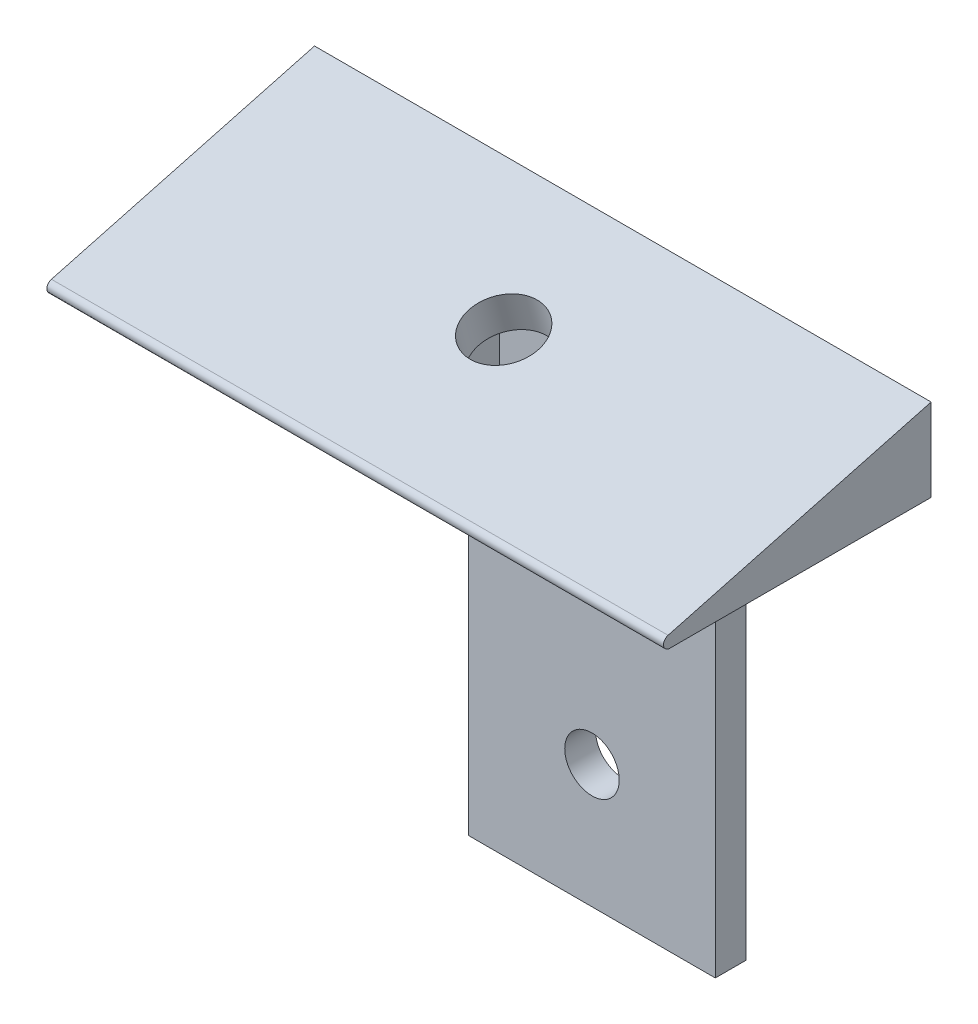
ISO-10303-21;
HEADER;
FILE_DESCRIPTION(('STEP AP214'),'2;1');
FILE_NAME('part.step','',(''),(''),'','','');
FILE_SCHEMA(('AUTOMOTIVE_DESIGN { 1 0 10303 214 1 1 1 1 }'));
ENDSEC;
DATA;
#1=APPLICATION_CONTEXT('core data for automotive mechanical design processes');
#2=APPLICATION_PROTOCOL_DEFINITION('international standard','automotive_design',2000,#1);
#3=PRODUCT_CONTEXT('',#1,'mechanical');
#4=PRODUCT('Part','Part','',(#3));
#5=PRODUCT_RELATED_PRODUCT_CATEGORY('part','',(#4));
#6=PRODUCT_DEFINITION_FORMATION('','',#4);
#7=PRODUCT_DEFINITION_CONTEXT('part definition',#1,'design');
#8=PRODUCT_DEFINITION('design','',#6,#7);
#9=PRODUCT_DEFINITION_SHAPE('','',#8);
#10=(LENGTH_UNIT() NAMED_UNIT(*) SI_UNIT(.MILLI.,.METRE.));
#11=(NAMED_UNIT(*) PLANE_ANGLE_UNIT() SI_UNIT($,.RADIAN.));
#12=(NAMED_UNIT(*) SI_UNIT($,.STERADIAN.) SOLID_ANGLE_UNIT());
#13=UNCERTAINTY_MEASURE_WITH_UNIT(LENGTH_MEASURE(1.E-05),#10,'distance_accuracy_value','');
#14=(GEOMETRIC_REPRESENTATION_CONTEXT(3) GLOBAL_UNCERTAINTY_ASSIGNED_CONTEXT((#13)) GLOBAL_UNIT_ASSIGNED_CONTEXT((#10,
#11,#12)) REPRESENTATION_CONTEXT('',''));
#15=CARTESIAN_POINT('',(0.,0.,0.));
#16=DIRECTION('',(0.,0.,1.));
#17=DIRECTION('',(1.,0.,0.));
#18=AXIS2_PLACEMENT_3D('',#15,#16,#17);
#19=CARTESIAN_POINT('',(0.,30.620384986886,12.2672579938712));
#20=DIRECTION('',(0.,0.96592582628907,0.258819045102515));
#21=DIRECTION('',(0.,-0.258819045102515,0.96592582628907));
#22=AXIS2_PLACEMENT_3D('',#19,#20,#21);
#23=CYLINDRICAL_SURFACE('',#22,3.57124);
#24=CARTESIAN_POINT('',(0.,30.620384986886,12.2672579938712));
#25=DIRECTION('',(0.,0.96592582628907,0.258819045102515));
#26=DIRECTION('',(0.,-0.258819045102515,0.96592582628907));
#27=AXIS2_PLACEMENT_3D('',#24,#25,#26);
#28=CIRCLE('',#27,3.57124);
#29=CARTESIAN_POINT('',(0.,29.6960800602541,15.7168109417478));
#30=VERTEX_POINT('',#29);
#31=EDGE_CURVE('E181',#30,#30,#28,.T.);
#32=CARTESIAN_POINT('',(0.,26.9402075887246,11.2811574320306));
#33=DIRECTION('',(0.,-0.96592582628907,-0.258819045102514));
#34=DIRECTION('',(0.,0.258819045102515,-0.96592582628907));
#35=AXIS2_PLACEMENT_3D('',#32,#33,#34);
#36=CIRCLE('',#35,3.57124);
#37=CARTESIAN_POINT('',(0.,26.0159026620927,14.7307103799072));
#38=VERTEX_POINT('',#37);
#39=EDGE_CURVE('E47',#38,#38,#36,.F.);
#40=CARTESIAN_POINT('',(0.,29.6960800602541,15.7168109417478));
#41=CARTESIAN_POINT('',(0.,29.6577448790232,15.7065390608953));
#42=CARTESIAN_POINT('',(0.,29.6194096977924,15.6962671800428));
#43=CARTESIAN_POINT('',(0.,29.5427393353307,15.6757234183377));
#44=CARTESIAN_POINT('',(0.,29.5044041540999,15.6654515374852));
#45=CARTESIAN_POINT('',(0.,29.4277337916382,15.6449077757802));
#46=CARTESIAN_POINT('',(0.,29.3893986104073,15.6346358949277));
#47=CARTESIAN_POINT('',(0.,29.3127282479456,15.6140921332227));
#48=CARTESIAN_POINT('',(0.,29.2743930667148,15.6038202523702));
#49=CARTESIAN_POINT('',(0.,29.1977227042531,15.5832764906652));
#50=CARTESIAN_POINT('',(0.,29.1593875230222,15.5730046098127));
#51=CARTESIAN_POINT('',(0.,29.0827171605605,15.5524608481077));
#52=CARTESIAN_POINT('',(0.,29.0443819793297,15.5421889672552));
#53=CARTESIAN_POINT('',(0.,28.967711616868,15.5216452055501));
#54=CARTESIAN_POINT('',(0.,28.9293764356371,15.5113733246976));
#55=CARTESIAN_POINT('',(0.,28.8527060731754,15.4908295629926));
#56=CARTESIAN_POINT('',(0.,28.8143708919446,15.4805576821401));
#57=CARTESIAN_POINT('',(0.,28.7377005294829,15.4600139204351));
#58=CARTESIAN_POINT('',(0.,28.6993653482521,15.4497420395826));
#59=CARTESIAN_POINT('',(0.,28.6226949857904,15.4291982778776));
#60=CARTESIAN_POINT('',(0.,28.5843598045595,15.4189263970251));
#61=CARTESIAN_POINT('',(0.,28.5076894420978,15.3983826353201));
#62=CARTESIAN_POINT('',(0.,28.469354260867,15.3881107544676));
#63=CARTESIAN_POINT('',(0.,28.3926838984053,15.3675669927626));
#64=CARTESIAN_POINT('',(0.,28.3543487171744,15.3572951119101));
#65=CARTESIAN_POINT('',(0.,28.2776783547127,15.336751350205));
#66=CARTESIAN_POINT('',(0.,28.2393431734819,15.3264794693525));
#67=CARTESIAN_POINT('',(0.,28.1626728110202,15.3059357076475));
#68=CARTESIAN_POINT('',(0.,28.1243376297893,15.295663826795));
#69=CARTESIAN_POINT('',(0.,28.0476672673277,15.27512006509));
#70=CARTESIAN_POINT('',(0.,28.0093320860968,15.2648481842375));
#71=CARTESIAN_POINT('',(0.,27.9326617236351,15.2443044225325));
#72=CARTESIAN_POINT('',(0.,27.8943265424043,15.23403254168));
#73=CARTESIAN_POINT('',(0.,27.8176561799426,15.213488779975));
#74=CARTESIAN_POINT('',(0.,27.7793209987117,15.2032168991225));
#75=CARTESIAN_POINT('',(0.,27.70265063625,15.1826731374174));
#76=CARTESIAN_POINT('',(0.,27.6643154550192,15.1724012565649));
#77=CARTESIAN_POINT('',(0.,27.5876450925575,15.1518574948599));
#78=CARTESIAN_POINT('',(0.,27.5493099113266,15.1415856140074));
#79=CARTESIAN_POINT('',(0.,27.4726395488649,15.1210418523024));
#80=CARTESIAN_POINT('',(0.,27.4343043676341,15.1107699714499));
#81=CARTESIAN_POINT('',(0.,27.3576340051724,15.0902262097449));
#82=CARTESIAN_POINT('',(0.,27.3192988239415,15.0799543288924));
#83=CARTESIAN_POINT('',(0.,27.2426284614799,15.0594105671874));
#84=CARTESIAN_POINT('',(0.,27.204293280249,15.0491386863349));
#85=CARTESIAN_POINT('',(0.,27.1276229177873,15.0285949246299));
#86=CARTESIAN_POINT('',(0.,27.0892877365565,15.0183230437774));
#87=CARTESIAN_POINT('',(0.,27.0126173740948,14.9977792820723));
#88=CARTESIAN_POINT('',(0.,26.9742821928639,14.9875074012198));
#89=CARTESIAN_POINT('',(0.,26.8976118304022,14.9669636395148));
#90=CARTESIAN_POINT('',(0.,26.8592766491714,14.9566917586623));
#91=CARTESIAN_POINT('',(0.,26.7826062867097,14.9361479969573));
#92=CARTESIAN_POINT('',(0.,26.7442711054788,14.9258761161048));
#93=CARTESIAN_POINT('',(0.,26.6676007430171,14.9053323543998));
#94=CARTESIAN_POINT('',(0.,26.6292655617863,14.8950604735473));
#95=CARTESIAN_POINT('',(0.,26.5525951993246,14.8745167118423));
#96=CARTESIAN_POINT('',(0.,26.5142600180938,14.8642448309898));
#97=CARTESIAN_POINT('',(0.,26.4375896556321,14.8437010692847));
#98=CARTESIAN_POINT('',(0.,26.3992544744012,14.8334291884322));
#99=CARTESIAN_POINT('',(0.,26.3225841119395,14.8128854267272));
#100=CARTESIAN_POINT('',(0.,26.2842489307087,14.8026135458747));
#101=CARTESIAN_POINT('',(0.,26.207578568247,14.7820697841697));
#102=CARTESIAN_POINT('',(0.,26.1692433870161,14.7717979033172));
#103=CARTESIAN_POINT('',(0.,26.0925730245544,14.7512541416122));
#104=CARTESIAN_POINT('',(0.,26.0542378433236,14.7409822607597));
#105=CARTESIAN_POINT('',(0.,26.0159026620927,14.7307103799072));
#106=B_SPLINE_CURVE_WITH_KNOTS('',3,(#40,#41,#42,#43,#44,#45,#46,#47,#48,#49,#50,#51,#52,#53,
#54,#55,#56,#57,#58,#59,#60,#61,#62,#63,#64,#65,#66,#67,#68,#69,#70,#71,#72,#73,#74,#75,#76,#77,
#78,#79,#80,#81,#82,#83,#84,#85,#86,#87,#88,#89,#90,#91,#92,#93,#94,#95,#96,#97,#98,#99,#100,
#101,#102,#103,#104,#105),.UNSPECIFIED.,.F.,.F.,(4,2,2,2,2,2,2,2,2,2,2,2,2,2,2,2,2,2,2,2,2,2,2,
2,2,2,2,2,2,2,2,2,4),(0.,0.119062500000001,0.238125000000002,0.357187500000001,
0.476250000000002,0.595312500000003,0.714375000000001,0.833437500000002,0.952500000000003,
1.0715625,1.190625,1.3096875,1.42875,1.5478125,1.666875,1.7859375,1.905,2.0240625,2.143125,
2.2621875,2.38125,2.5003125,2.619375,2.7384375,2.8575,2.9765625,3.095625,3.2146875,3.33375,
3.4528125,3.571875,3.6909375,3.81),.UNSPECIFIED.);
#107=EDGE_CURVE('BSEAM43',#30,#38,#106,.T.);
#108=ORIENTED_EDGE('',*,*,#31,.T.);
#109=ORIENTED_EDGE('',*,*,#39,.F.);
#110=ORIENTED_EDGE('',*,*,#107,.T.);
#111=ORIENTED_EDGE('',*,*,#107,.F.);
#112=EDGE_LOOP('',(#108,#110,#109,#111));
#113=FACE_BOUND('',#112,.T.);
#114=ADVANCED_FACE('F43',(#113),#23,.F.);
#115=CARTESIAN_POINT('',(31.75,33.9073868596879,0.));
#116=DIRECTION('',(0.,-0.96592582628907,-0.258819045102514));
#117=DIRECTION('',(0.,0.258819045102515,-0.96592582628907));
#118=AXIS2_PLACEMENT_3D('',#115,#116,#117);
#119=PLANE('',#118);
#120=DIRECTION('',(0.,-0.258819045102514,0.96592582628907));
#121=VECTOR('',#120,1.);
#122=CARTESIAN_POINT('',(-31.75,33.9073868596879,0.));
#123=LINE('',#122,#121);
#124=CARTESIAN_POINT('',(-31.75,33.9073868596879,0.));
#125=VERTEX_POINT('',#124);
#126=CARTESIAN_POINT('',(-31.75,26.6483628996936,27.0910462320595));
#127=VERTEX_POINT('',#126);
#128=EDGE_CURVE('E233',#125,#127,#123,.T.);
#129=ORIENTED_EDGE('',*,*,#128,.T.);
#130=DIRECTION('',(-1.,0.,0.));
#131=VECTOR('',#130,1.);
#132=CARTESIAN_POINT('',(31.75,26.6483628996936,27.0910462320595));
#133=LINE('',#132,#131);
#134=CARTESIAN_POINT('',(31.75,26.6483628996936,27.0910462320595));
#135=VERTEX_POINT('',#134);
#136=EDGE_CURVE('E53',#127,#135,#133,.F.);
#137=ORIENTED_EDGE('',*,*,#136,.T.);
#138=DIRECTION('',(0.,-0.258819045102514,0.96592582628907));
#139=VECTOR('',#138,1.);
#140=CARTESIAN_POINT('',(31.75,33.9073868596879,0.));
#141=LINE('',#140,#139);
#142=CARTESIAN_POINT('',(31.75,33.9073868596879,0.));
#143=VERTEX_POINT('',#142);
#144=EDGE_CURVE('E221',#143,#135,#141,.T.);
#145=ORIENTED_EDGE('',*,*,#144,.F.);
#146=DIRECTION('',(-1.,0.,0.));
#147=VECTOR('',#146,1.);
#148=CARTESIAN_POINT('',(31.75,33.9073868596879,0.));
#149=LINE('',#148,#147);
#150=EDGE_CURVE('E243',#143,#125,#149,.T.);
#151=ORIENTED_EDGE('',*,*,#150,.T.);
#152=EDGE_LOOP('',(#129,#137,#145,#151));
#153=FACE_BOUND('',#152,.T.);
#154=ORIENTED_EDGE('',*,*,#31,.F.);
#155=EDGE_LOOP('',(#154));
#156=FACE_BOUND('',#155,.T.);
#157=ADVANCED_FACE('F318',(#153,#156),#119,.F.);
#158=CARTESIAN_POINT('',(31.75,25.4,31.75));
#159=DIRECTION('',(0.,1.,0.));
#160=DIRECTION('',(0.,0.,1.));
#161=AXIS2_PLACEMENT_3D('',#158,#159,#160);
#162=PLANE('',#161);
#163=DIRECTION('',(1.,0.,0.));
#164=VECTOR('',#163,1.);
#165=CARTESIAN_POINT('',(0.,25.4,17.0292904073542));
#166=LINE('',#165,#164);
#167=CARTESIAN_POINT('',(-9.52500000000001,25.4,17.0292904073542));
#168=VERTEX_POINT('',#167);
#169=CARTESIAN_POINT('',(9.525,25.4,17.0292904073542));
#170=VERTEX_POINT('',#169);
#171=EDGE_CURVE('E158',#168,#170,#166,.T.);
#172=ORIENTED_EDGE('',*,*,#171,.T.);
#173=DIRECTION('',(0.,0.,1.));
#174=VECTOR('',#173,1.);
#175=CARTESIAN_POINT('',(9.525,25.4,3.175));
#176=LINE('',#175,#174);
#177=CARTESIAN_POINT('',(9.525,25.4,15.8750000000001));
#178=VERTEX_POINT('',#177);
#179=EDGE_CURVE('E174',#178,#170,#176,.T.);
#180=ORIENTED_EDGE('',*,*,#179,.F.);
#181=DIRECTION('',(1.,0.,0.));
#182=VECTOR('',#181,1.);
#183=CARTESIAN_POINT('',(9.525,25.4,15.8750000000001));
#184=LINE('',#183,#182);
#185=CARTESIAN_POINT('',(25.4000000000001,25.4,15.8750000000001));
#186=VERTEX_POINT('',#185);
#187=EDGE_CURVE('E196',#178,#186,#184,.T.);
#188=ORIENTED_EDGE('',*,*,#187,.T.);
#189=DIRECTION('',(0.,0.,-1.));
#190=VECTOR('',#189,1.);
#191=CARTESIAN_POINT('',(25.4000000000001,25.4,0.));
#192=LINE('',#191,#190);
#193=CARTESIAN_POINT('',(25.4000000000001,25.4,0.));
#194=VERTEX_POINT('',#193);
#195=EDGE_CURVE('E68',#186,#194,#192,.T.);
#196=ORIENTED_EDGE('',*,*,#195,.T.);
#197=DIRECTION('',(-1.,0.,0.));
#198=VECTOR('',#197,1.);
#199=CARTESIAN_POINT('',(31.75,25.4,0.));
#200=LINE('',#199,#198);
#201=CARTESIAN_POINT('',(31.75,25.4,0.));
#202=VERTEX_POINT('',#201);
#203=EDGE_CURVE('E239',#202,#194,#200,.T.);
#204=ORIENTED_EDGE('',*,*,#203,.F.);
#205=DIRECTION('',(0.,0.,-1.));
#206=VECTOR('',#205,1.);
#207=CARTESIAN_POINT('',(31.75,25.4,31.75));
#208=LINE('',#207,#206);
#209=CARTESIAN_POINT('',(31.75,25.4,26.9266961384194));
#210=VERTEX_POINT('',#209);
#211=EDGE_CURVE('E226',#210,#202,#208,.T.);
#212=ORIENTED_EDGE('',*,*,#211,.F.);
#213=DIRECTION('',(-1.,0.,0.));
#214=VECTOR('',#213,1.);
#215=CARTESIAN_POINT('',(31.75,25.4,26.9266961384194));
#216=LINE('',#215,#214);
#217=CARTESIAN_POINT('',(-31.75,25.4,26.9266961384194));
#218=VERTEX_POINT('',#217);
#219=EDGE_CURVE('E308',#210,#218,#216,.T.);
#220=ORIENTED_EDGE('',*,*,#219,.T.);
#221=DIRECTION('',(0.,0.,-1.));
#222=VECTOR('',#221,1.);
#223=CARTESIAN_POINT('',(-31.75,25.4,31.75));
#224=LINE('',#223,#222);
#225=CARTESIAN_POINT('',(-31.75,25.4,0.));
#226=VERTEX_POINT('',#225);
#227=EDGE_CURVE('E222',#218,#226,#224,.T.);
#228=ORIENTED_EDGE('',*,*,#227,.T.);
#229=CARTESIAN_POINT('',(-25.3999999999999,25.4,0.));
#230=VERTEX_POINT('',#229);
#231=EDGE_CURVE('E229',#230,#226,#200,.T.);
#232=ORIENTED_EDGE('',*,*,#231,.F.);
#233=DIRECTION('',(0.,0.,1.));
#234=VECTOR('',#233,1.);
#235=CARTESIAN_POINT('',(-25.3999999999999,25.4,3.175));
#236=LINE('',#235,#234);
#237=CARTESIAN_POINT('',(-25.3999999999999,25.4,15.8750000000001));
#238=VERTEX_POINT('',#237);
#239=EDGE_CURVE('E290',#230,#238,#236,.T.);
#240=ORIENTED_EDGE('',*,*,#239,.T.);
#241=DIRECTION('',(-1.,0.,0.));
#242=VECTOR('',#241,1.);
#243=CARTESIAN_POINT('',(-9.525,25.4,15.8750000000001));
#244=LINE('',#243,#242);
#245=CARTESIAN_POINT('',(-9.52500000000001,25.4,15.8750000000001));
#246=VERTEX_POINT('',#245);
#247=EDGE_CURVE('E171',#246,#238,#244,.T.);
#248=ORIENTED_EDGE('',*,*,#247,.F.);
#249=DIRECTION('',(0.,0.,-1.));
#250=VECTOR('',#249,1.);
#251=CARTESIAN_POINT('',(-9.52500000000001,25.4,19.05));
#252=LINE('',#251,#250);
#253=EDGE_CURVE('E151',#168,#246,#252,.T.);
#254=ORIENTED_EDGE('',*,*,#253,.F.);
#255=EDGE_LOOP('',(#172,#180,#188,#196,#204,#212,#220,#228,#232,#240,#248,#254));
#256=FACE_BOUND('',#255,.T.);
#257=ADVANCED_FACE('F169',(#256),#162,.F.);
#258=CARTESIAN_POINT('',(0.,0.,0.));
#259=DIRECTION('',(0.,0.,1.));
#260=DIRECTION('',(1.,0.,0.));
#261=AXIS2_PLACEMENT_3D('',#258,#259,#260);
#262=PLANE('',#261);
#263=CARTESIAN_POINT('',(0.,12.7,0.));
#264=DIRECTION('',(0.,0.,-1.));
#265=DIRECTION('',(-1.,0.,0.));
#266=AXIS2_PLACEMENT_3D('',#263,#264,#265);
#267=CIRCLE('',#266,2.8067);
#268=CARTESIAN_POINT('',(-2.8067,12.7,0.));
#269=VERTEX_POINT('',#268);
#270=EDGE_CURVE('E247',#269,#269,#267,.T.);
#271=ORIENTED_EDGE('',*,*,#270,.F.);
#272=EDGE_LOOP('',(#271));
#273=FACE_BOUND('',#272,.T.);
#274=DIRECTION('',(0.,-1.,0.));
#275=VECTOR('',#274,1.);
#276=CARTESIAN_POINT('',(-12.7,25.4,0.));
#277=LINE('',#276,#275);
#278=CARTESIAN_POINT('',(-12.7,12.6999999999999,0.));
#279=VERTEX_POINT('',#278);
#280=CARTESIAN_POINT('',(-12.7,-25.4,0.));
#281=VERTEX_POINT('',#280);
#282=EDGE_CURVE('E263',#279,#281,#277,.T.);
#283=ORIENTED_EDGE('',*,*,#282,.F.);
#284=DIRECTION('',(0.707106781186544,-0.707106781186551,0.));
#285=VECTOR('',#284,1.);
#286=CARTESIAN_POINT('',(0.,0.,0.));
#287=LINE('',#286,#285);
#288=EDGE_CURVE('E305',#279,#230,#287,.F.);
#289=ORIENTED_EDGE('',*,*,#288,.T.);
#290=ORIENTED_EDGE('',*,*,#231,.T.);
#291=DIRECTION('',(0.,1.,0.));
#292=VECTOR('',#291,1.);
#293=CARTESIAN_POINT('',(-31.75,25.4,0.));
#294=LINE('',#293,#292);
#295=EDGE_CURVE('E213',#226,#125,#294,.T.);
#296=ORIENTED_EDGE('',*,*,#295,.T.);
#297=ORIENTED_EDGE('',*,*,#150,.F.);
#298=DIRECTION('',(0.,1.,0.));
#299=VECTOR('',#298,1.);
#300=CARTESIAN_POINT('',(31.75,25.4,0.));
#301=LINE('',#300,#299);
#302=EDGE_CURVE('E217',#202,#143,#301,.T.);
#303=ORIENTED_EDGE('',*,*,#302,.F.);
#304=ORIENTED_EDGE('',*,*,#203,.T.);
#305=DIRECTION('',(0.707106781186551,0.707106781186544,0.));
#306=VECTOR('',#305,1.);
#307=CARTESIAN_POINT('',(0.,0.,0.));
#308=LINE('',#307,#306);
#309=CARTESIAN_POINT('',(12.7,12.7,0.));
#310=VERTEX_POINT('',#309);
#311=EDGE_CURVE('E302',#194,#310,#308,.F.);
#312=ORIENTED_EDGE('',*,*,#311,.T.);
#313=DIRECTION('',(0.,1.,0.));
#314=VECTOR('',#313,1.);
#315=CARTESIAN_POINT('',(12.7,25.4,0.));
#316=LINE('',#315,#314);
#317=CARTESIAN_POINT('',(12.7,-25.4,0.));
#318=VERTEX_POINT('',#317);
#319=EDGE_CURVE('E268',#318,#310,#316,.T.);
#320=ORIENTED_EDGE('',*,*,#319,.F.);
#321=DIRECTION('',(1.,0.,0.));
#322=VECTOR('',#321,1.);
#323=CARTESIAN_POINT('',(-12.7,-25.4,0.));
#324=LINE('',#323,#322);
#325=EDGE_CURVE('E277',#281,#318,#324,.T.);
#326=ORIENTED_EDGE('',*,*,#325,.F.);
#327=EDGE_LOOP('',(#283,#289,#290,#296,#297,#303,#304,#312,#320,#326));
#328=FACE_BOUND('',#327,.T.);
#329=CARTESIAN_POINT('',(0.,-12.7,0.));
#330=DIRECTION('',(0.,0.,-1.));
#331=DIRECTION('',(-1.,0.,0.));
#332=AXIS2_PLACEMENT_3D('',#329,#330,#331);
#333=CIRCLE('',#332,2.8067);
#334=CARTESIAN_POINT('',(-2.8067,-12.7,0.));
#335=VERTEX_POINT('',#334);
#336=EDGE_CURVE('E255',#335,#335,#333,.T.);
#337=ORIENTED_EDGE('',*,*,#336,.F.);
#338=EDGE_LOOP('',(#337));
#339=FACE_BOUND('',#338,.T.);
#340=ADVANCED_FACE('F337',(#273,#328,#339),#262,.F.);
#341=CARTESIAN_POINT('',(-12.7,25.4,3.175));
#342=DIRECTION('',(1.,0.,0.));
#343=DIRECTION('',(0.,0.,-1.));
#344=AXIS2_PLACEMENT_3D('',#341,#342,#343);
#345=PLANE('',#344);
#346=DIRECTION('',(0.,-1.,0.));
#347=VECTOR('',#346,1.);
#348=CARTESIAN_POINT('',(-12.7,25.4,3.175));
#349=LINE('',#348,#347);
#350=CARTESIAN_POINT('',(-12.7,12.6999999999999,3.175));
#351=VERTEX_POINT('',#350);
#352=CARTESIAN_POINT('',(-12.7,-25.4,3.175));
#353=VERTEX_POINT('',#352);
#354=EDGE_CURVE('E264',#351,#353,#349,.T.);
#355=ORIENTED_EDGE('',*,*,#354,.F.);
#356=DIRECTION('',(0.,0.,-1.));
#357=VECTOR('',#356,1.);
#358=CARTESIAN_POINT('',(-12.7,12.6999999999999,0.));
#359=LINE('',#358,#357);
#360=EDGE_CURVE('E298',#351,#279,#359,.T.);
#361=ORIENTED_EDGE('',*,*,#360,.T.);
#362=ORIENTED_EDGE('',*,*,#282,.T.);
#363=DIRECTION('',(0.,0.,-1.));
#364=VECTOR('',#363,1.);
#365=CARTESIAN_POINT('',(-12.7,-25.4,3.175));
#366=LINE('',#365,#364);
#367=EDGE_CURVE('E286',#353,#281,#366,.T.);
#368=ORIENTED_EDGE('',*,*,#367,.F.);
#369=EDGE_LOOP('',(#355,#361,#362,#368));
#370=FACE_BOUND('',#369,.T.);
#371=ADVANCED_FACE('F369',(#370),#345,.F.);
#372=CARTESIAN_POINT('',(-12.7,-25.4,3.175));
#373=DIRECTION('',(0.,1.,0.));
#374=DIRECTION('',(0.,0.,1.));
#375=AXIS2_PLACEMENT_3D('',#372,#373,#374);
#376=PLANE('',#375);
#377=ORIENTED_EDGE('',*,*,#325,.T.);
#378=DIRECTION('',(0.,0.,-1.));
#379=VECTOR('',#378,1.);
#380=CARTESIAN_POINT('',(12.7,-25.4,3.175));
#381=LINE('',#380,#379);
#382=CARTESIAN_POINT('',(12.7,-25.4,3.175));
#383=VERTEX_POINT('',#382);
#384=EDGE_CURVE('E274',#383,#318,#381,.T.);
#385=ORIENTED_EDGE('',*,*,#384,.F.);
#386=DIRECTION('',(1.,0.,0.));
#387=VECTOR('',#386,1.);
#388=CARTESIAN_POINT('',(-12.7,-25.4,3.175));
#389=LINE('',#388,#387);
#390=EDGE_CURVE('E267',#353,#383,#389,.T.);
#391=ORIENTED_EDGE('',*,*,#390,.F.);
#392=ORIENTED_EDGE('',*,*,#367,.T.);
#393=EDGE_LOOP('',(#377,#385,#391,#392));
#394=FACE_BOUND('',#393,.T.);
#395=ADVANCED_FACE('F366',(#394),#376,.F.);
#396=CARTESIAN_POINT('',(12.7,25.4,3.175));
#397=DIRECTION('',(-1.,0.,0.));
#398=DIRECTION('',(0.,-1.,0.));
#399=AXIS2_PLACEMENT_3D('',#396,#397,#398);
#400=PLANE('',#399);
#401=ORIENTED_EDGE('',*,*,#319,.T.);
#402=DIRECTION('',(0.,0.,1.));
#403=VECTOR('',#402,1.);
#404=CARTESIAN_POINT('',(12.7,12.7,3.175));
#405=LINE('',#404,#403);
#406=CARTESIAN_POINT('',(12.7,12.7,3.175));
#407=VERTEX_POINT('',#406);
#408=EDGE_CURVE('E295',#310,#407,#405,.T.);
#409=ORIENTED_EDGE('',*,*,#408,.T.);
#410=DIRECTION('',(0.,1.,0.));
#411=VECTOR('',#410,1.);
#412=CARTESIAN_POINT('',(12.7,25.4,3.175));
#413=LINE('',#412,#411);
#414=EDGE_CURVE('E271',#383,#407,#413,.T.);
#415=ORIENTED_EDGE('',*,*,#414,.F.);
#416=ORIENTED_EDGE('',*,*,#384,.T.);
#417=EDGE_LOOP('',(#401,#409,#415,#416));
#418=FACE_BOUND('',#417,.T.);
#419=ADVANCED_FACE('F359',(#418),#400,.F.);
#420=CARTESIAN_POINT('',(0.,0.,3.175));
#421=DIRECTION('',(0.,0.,1.));
#422=DIRECTION('',(1.,0.,0.));
#423=AXIS2_PLACEMENT_3D('',#420,#421,#422);
#424=PLANE('',#423);
#425=DIRECTION('',(1.,0.,0.));
#426=VECTOR('',#425,1.);
#427=CARTESIAN_POINT('',(9.525,12.6999999999999,3.175));
#428=LINE('',#427,#426);
#429=CARTESIAN_POINT('',(9.525,12.6999999999999,3.175));
#430=VERTEX_POINT('',#429);
#431=EDGE_CURVE('E60',#430,#407,#428,.T.);
#432=ORIENTED_EDGE('',*,*,#431,.F.);
#433=DIRECTION('',(0.,1.,0.));
#434=VECTOR('',#433,1.);
#435=CARTESIAN_POINT('',(9.525,25.4,3.175));
#436=LINE('',#435,#434);
#437=CARTESIAN_POINT('',(9.525,29.1122459263567,3.175));
#438=VERTEX_POINT('',#437);
#439=EDGE_CURVE('E189',#430,#438,#436,.T.);
#440=ORIENTED_EDGE('',*,*,#439,.T.);
#441=DIRECTION('',(-1.,0.,0.));
#442=VECTOR('',#441,1.);
#443=CARTESIAN_POINT('',(-9.52500000000001,29.1122459263567,3.175));
#444=LINE('',#443,#442);
#445=CARTESIAN_POINT('',(-9.52500000000001,29.1122459263567,3.175));
#446=VERTEX_POINT('',#445);
#447=EDGE_CURVE('E177',#438,#446,#444,.T.);
#448=ORIENTED_EDGE('',*,*,#447,.T.);
#449=DIRECTION('',(0.,-1.,0.));
#450=VECTOR('',#449,1.);
#451=CARTESIAN_POINT('',(-9.525,25.4,3.175));
#452=LINE('',#451,#450);
#453=CARTESIAN_POINT('',(-9.525,12.6999999999999,3.175));
#454=VERTEX_POINT('',#453);
#455=EDGE_CURVE('E153',#446,#454,#452,.T.);
#456=ORIENTED_EDGE('',*,*,#455,.T.);
#457=DIRECTION('',(-1.,0.,0.));
#458=VECTOR('',#457,1.);
#459=CARTESIAN_POINT('',(-9.525,12.6999999999999,3.175));
#460=LINE('',#459,#458);
#461=EDGE_CURVE('E210',#454,#351,#460,.T.);
#462=ORIENTED_EDGE('',*,*,#461,.T.);
#463=ORIENTED_EDGE('',*,*,#354,.T.);
#464=ORIENTED_EDGE('',*,*,#390,.T.);
#465=ORIENTED_EDGE('',*,*,#414,.T.);
#466=EDGE_LOOP('',(#432,#440,#448,#456,#462,#463,#464,#465));
#467=FACE_BOUND('',#466,.T.);
#468=CARTESIAN_POINT('',(0.,12.7,3.175));
#469=DIRECTION('',(0.,0.,1.));
#470=DIRECTION('',(1.,0.,0.));
#471=AXIS2_PLACEMENT_3D('',#468,#469,#470);
#472=CIRCLE('',#471,2.8067);
#473=CARTESIAN_POINT('',(2.8067,12.7,3.175));
#474=VERTEX_POINT('',#473);
#475=EDGE_CURVE('E251',#474,#474,#472,.T.);
#476=ORIENTED_EDGE('',*,*,#475,.F.);
#477=EDGE_LOOP('',(#476));
#478=FACE_BOUND('',#477,.T.);
#479=CARTESIAN_POINT('',(0.,-12.7,3.175));
#480=DIRECTION('',(0.,0.,1.));
#481=DIRECTION('',(1.,0.,0.));
#482=AXIS2_PLACEMENT_3D('',#479,#480,#481);
#483=CIRCLE('',#482,2.8067);
#484=CARTESIAN_POINT('',(2.8067,-12.7,3.175));
#485=VERTEX_POINT('',#484);
#486=EDGE_CURVE('E259',#485,#485,#483,.T.);
#487=ORIENTED_EDGE('',*,*,#486,.F.);
#488=EDGE_LOOP('',(#487));
#489=FACE_BOUND('',#488,.T.);
#490=ADVANCED_FACE('F346',(#467,#478,#489),#424,.T.);
#491=CARTESIAN_POINT('',(0.,-12.7,0.));
#492=DIRECTION('',(0.,0.,-1.));
#493=DIRECTION('',(-1.,0.,0.));
#494=AXIS2_PLACEMENT_3D('',#491,#492,#493);
#495=CYLINDRICAL_SURFACE('',#494,2.8067);
#496=ORIENTED_EDGE('',*,*,#336,.T.);
#497=EDGE_LOOP('',(#496));
#498=FACE_BOUND('',#497,.T.);
#499=ORIENTED_EDGE('',*,*,#486,.T.);
#500=EDGE_LOOP('',(#499));
#501=FACE_BOUND('',#500,.T.);
#502=ADVANCED_FACE('F435',(#498,#501),#495,.F.);
#503=CARTESIAN_POINT('',(0.,12.7,0.));
#504=DIRECTION('',(0.,0.,-1.));
#505=DIRECTION('',(-1.,0.,0.));
#506=AXIS2_PLACEMENT_3D('',#503,#504,#505);
#507=CYLINDRICAL_SURFACE('',#506,2.8067);
#508=ORIENTED_EDGE('',*,*,#270,.T.);
#509=EDGE_LOOP('',(#508));
#510=FACE_BOUND('',#509,.T.);
#511=ORIENTED_EDGE('',*,*,#475,.T.);
#512=EDGE_LOOP('',(#511));
#513=FACE_BOUND('',#512,.T.);
#514=ADVANCED_FACE('F497',(#510,#513),#507,.F.);
#515=CARTESIAN_POINT('',(31.75,0.,0.));
#516=DIRECTION('',(-1.,0.,0.));
#517=DIRECTION('',(0.,0.,1.));
#518=AXIS2_PLACEMENT_3D('',#515,#516,#517);
#519=PLANE('',#518);
#520=ORIENTED_EDGE('',*,*,#144,.T.);
#521=CARTESIAN_POINT('',(31.75,26.035,26.9266961384194));
#522=DIRECTION('',(-1.,0.,0.));
#523=DIRECTION('',(0.,0.,1.));
#524=AXIS2_PLACEMENT_3D('',#521,#522,#523);
#525=CIRCLE('',#524,0.635);
#526=EDGE_CURVE('E12',#135,#210,#525,.F.);
#527=ORIENTED_EDGE('',*,*,#526,.T.);
#528=ORIENTED_EDGE('',*,*,#211,.T.);
#529=ORIENTED_EDGE('',*,*,#302,.T.);
#530=EDGE_LOOP('',(#520,#527,#528,#529));
#531=FACE_BOUND('',#530,.T.);
#532=ADVANCED_FACE('F323',(#531),#519,.F.);
#533=CARTESIAN_POINT('',(-31.75,0.,0.));
#534=DIRECTION('',(-1.,0.,0.));
#535=DIRECTION('',(0.,0.,1.));
#536=AXIS2_PLACEMENT_3D('',#533,#534,#535);
#537=PLANE('',#536);
#538=ORIENTED_EDGE('',*,*,#227,.F.);
#539=CARTESIAN_POINT('',(-31.75,26.035,26.9266961384194));
#540=DIRECTION('',(-1.,0.,0.));
#541=DIRECTION('',(0.,0.,1.));
#542=AXIS2_PLACEMENT_3D('',#539,#540,#541);
#543=CIRCLE('',#542,0.635);
#544=EDGE_CURVE('E312',#218,#127,#543,.T.);
#545=ORIENTED_EDGE('',*,*,#544,.T.);
#546=ORIENTED_EDGE('',*,*,#128,.F.);
#547=ORIENTED_EDGE('',*,*,#295,.F.);
#548=EDGE_LOOP('',(#538,#545,#546,#547));
#549=FACE_BOUND('',#548,.T.);
#550=ADVANCED_FACE('F334',(#549),#537,.T.);
#551=CARTESIAN_POINT('',(25.4000000000001,25.4,31.75));
#552=DIRECTION('',(0.707106781186544,-0.707106781186551,0.));
#553=DIRECTION('',(0.,0.,1.));
#554=AXIS2_PLACEMENT_3D('',#551,#552,#553);
#555=PLANE('',#554);
#556=ORIENTED_EDGE('',*,*,#195,.F.);
#557=DIRECTION('',(-0.577350269189629,-0.577350269189624,-0.577350269189624));
#558=VECTOR('',#557,1.);
#559=CARTESIAN_POINT('',(22.0434187070232,22.0434187070231,12.5184187070232));
#560=LINE('',#559,#558);
#561=EDGE_CURVE('E185',#407,#186,#560,.F.);
#562=ORIENTED_EDGE('',*,*,#561,.F.);
#563=ORIENTED_EDGE('',*,*,#408,.F.);
#564=ORIENTED_EDGE('',*,*,#311,.F.);
#565=EDGE_LOOP('',(#556,#562,#563,#564));
#566=FACE_BOUND('',#565,.T.);
#567=ADVANCED_FACE('F356',(#566),#555,.T.);
#568=CARTESIAN_POINT('',(-12.7,12.6999999999999,3.175));
#569=DIRECTION('',(-0.707106781186551,-0.707106781186544,0.));
#570=DIRECTION('',(0.,0.,1.));
#571=AXIS2_PLACEMENT_3D('',#568,#569,#570);
#572=PLANE('',#571);
#573=ORIENTED_EDGE('',*,*,#360,.F.);
#574=DIRECTION('',(-0.577350269189622,0.577350269189628,0.577350269189628));
#575=VECTOR('',#574,1.);
#576=CARTESIAN_POINT('',(-22.0434187070229,22.0434187070229,12.518418707023));
#577=LINE('',#576,#575);
#578=EDGE_CURVE('E199',#238,#351,#577,.F.);
#579=ORIENTED_EDGE('',*,*,#578,.F.);
#580=ORIENTED_EDGE('',*,*,#239,.F.);
#581=ORIENTED_EDGE('',*,*,#288,.F.);
#582=EDGE_LOOP('',(#573,#579,#580,#581));
#583=FACE_BOUND('',#582,.T.);
#584=ADVANCED_FACE('F372',(#583),#572,.T.);
#585=CARTESIAN_POINT('',(31.75,26.035,26.9266961384194));
#586=DIRECTION('',(-1.,0.,0.));
#587=DIRECTION('',(0.,0.,1.));
#588=AXIS2_PLACEMENT_3D('',#585,#586,#587);
#589=CYLINDRICAL_SURFACE('',#588,0.635);
#590=ORIENTED_EDGE('',*,*,#526,.F.);
#591=ORIENTED_EDGE('',*,*,#136,.F.);
#592=ORIENTED_EDGE('',*,*,#544,.F.);
#593=ORIENTED_EDGE('',*,*,#219,.F.);
#594=EDGE_LOOP('',(#590,#591,#592,#593));
#595=FACE_BOUND('',#594,.T.);
#596=ADVANCED_FACE('F45',(#595),#589,.T.);
#597=CARTESIAN_POINT('',(-9.525,12.6999999999999,3.175));
#598=DIRECTION('',(0.,-0.707106781186548,0.707106781186548));
#599=DIRECTION('',(0.,-0.707106781186548,-0.707106781186548));
#600=AXIS2_PLACEMENT_3D('',#597,#598,#599);
#601=PLANE('',#600);
#602=ORIENTED_EDGE('',*,*,#247,.T.);
#603=ORIENTED_EDGE('',*,*,#578,.T.);
#604=ORIENTED_EDGE('',*,*,#461,.F.);
#605=DIRECTION('',(0.,0.707106781186548,0.707106781186548));
#606=VECTOR('',#605,1.);
#607=CARTESIAN_POINT('',(-9.525,12.6999999999999,3.175));
#608=LINE('',#607,#606);
#609=EDGE_CURVE('E207',#454,#246,#608,.T.);
#610=ORIENTED_EDGE('',*,*,#609,.T.);
#611=EDGE_LOOP('',(#602,#603,#604,#610));
#612=FACE_BOUND('',#611,.T.);
#613=ADVANCED_FACE('F374',(#612),#601,.T.);
#614=CARTESIAN_POINT('',(-9.525,0.,0.));
#615=DIRECTION('',(1.,0.,0.));
#616=DIRECTION('',(0.,0.,-1.));
#617=AXIS2_PLACEMENT_3D('',#614,#615,#616);
#618=PLANE('',#617);
#619=ORIENTED_EDGE('',*,*,#455,.F.);
#620=DIRECTION('',(0.,-0.258819045102514,0.96592582628907));
#621=VECTOR('',#620,1.);
#622=CARTESIAN_POINT('',(-9.52500000000001,26.9466651950378,11.2570573171747));
#623=LINE('',#622,#621);
#624=EDGE_CURVE('E146',#446,#168,#623,.T.);
#625=ORIENTED_EDGE('',*,*,#624,.T.);
#626=ORIENTED_EDGE('',*,*,#253,.T.);
#627=ORIENTED_EDGE('',*,*,#609,.F.);
#628=EDGE_LOOP('',(#619,#625,#626,#627));
#629=FACE_BOUND('',#628,.T.);
#630=ADVANCED_FACE('F148',(#629),#618,.T.);
#631=CARTESIAN_POINT('',(9.525,12.6999999999999,3.175));
#632=DIRECTION('',(0.,-0.707106781186548,0.707106781186547));
#633=DIRECTION('',(0.,-0.707106781186547,-0.707106781186548));
#634=AXIS2_PLACEMENT_3D('',#631,#632,#633);
#635=PLANE('',#634);
#636=ORIENTED_EDGE('',*,*,#431,.T.);
#637=ORIENTED_EDGE('',*,*,#561,.T.);
#638=ORIENTED_EDGE('',*,*,#187,.F.);
#639=DIRECTION('',(0.,-0.707106781186547,-0.707106781186548));
#640=VECTOR('',#639,1.);
#641=CARTESIAN_POINT('',(9.525,12.6999999999999,3.175));
#642=LINE('',#641,#640);
#643=EDGE_CURVE('E192',#178,#430,#642,.T.);
#644=ORIENTED_EDGE('',*,*,#643,.T.);
#645=EDGE_LOOP('',(#636,#637,#638,#644));
#646=FACE_BOUND('',#645,.T.);
#647=ADVANCED_FACE('F354',(#646),#635,.T.);
#648=CARTESIAN_POINT('',(9.525,0.,0.));
#649=DIRECTION('',(1.,0.,0.));
#650=DIRECTION('',(0.,1.,0.));
#651=AXIS2_PLACEMENT_3D('',#648,#649,#650);
#652=PLANE('',#651);
#653=ORIENTED_EDGE('',*,*,#439,.F.);
#654=ORIENTED_EDGE('',*,*,#643,.F.);
#655=ORIENTED_EDGE('',*,*,#179,.T.);
#656=DIRECTION('',(0.,0.258819045102514,-0.96592582628907));
#657=VECTOR('',#656,1.);
#658=CARTESIAN_POINT('',(9.525,30.9154151950377,-3.55451932536436));
#659=LINE('',#658,#657);
#660=EDGE_CURVE('E159',#170,#438,#659,.T.);
#661=ORIENTED_EDGE('',*,*,#660,.T.);
#662=EDGE_LOOP('',(#653,#654,#655,#661));
#663=FACE_BOUND('',#662,.T.);
#664=ADVANCED_FACE('F351',(#663),#652,.F.);
#665=CARTESIAN_POINT('',(31.75,30.2272094615266,-0.98610056184058));
#666=DIRECTION('',(0.,-0.96592582628907,-0.258819045102514));
#667=DIRECTION('',(0.,0.258819045102515,-0.96592582628907));
#668=AXIS2_PLACEMENT_3D('',#665,#666,#667);
#669=PLANE('',#668);
#670=ORIENTED_EDGE('',*,*,#447,.F.);
#671=ORIENTED_EDGE('',*,*,#660,.F.);
#672=ORIENTED_EDGE('',*,*,#171,.F.);
#673=ORIENTED_EDGE('',*,*,#624,.F.);
#674=EDGE_LOOP('',(#670,#671,#672,#673));
#675=FACE_BOUND('',#674,.T.);
#676=ORIENTED_EDGE('',*,*,#39,.T.);
#677=EDGE_LOOP('',(#676));
#678=FACE_BOUND('',#677,.T.);
#679=ADVANCED_FACE('F163',(#675,#678),#669,.T.);
#680=CLOSED_SHELL('',(#114,#157,#257,#340,#371,#395,#419,#490,#502,#514,#532,#550,#567,#584,
#596,#613,#630,#647,#664,#679));
#681=MANIFOLD_SOLID_BREP('B2',#680);
#682=ADVANCED_BREP_SHAPE_REPRESENTATION('',(#18,#681),#14);
#683=SHAPE_DEFINITION_REPRESENTATION(#9,#682);
ENDSEC;
END-ISO-10303-21;
